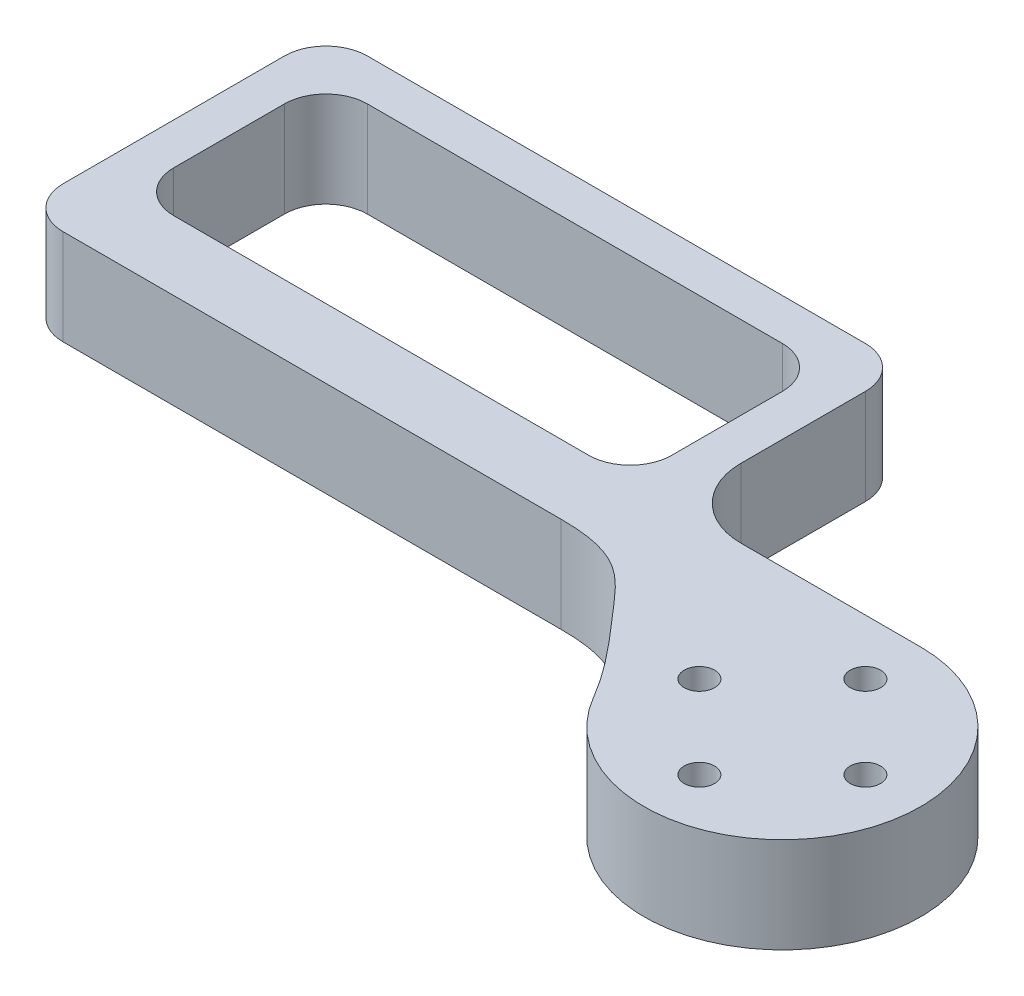
ISO-10303-21;
HEADER;
FILE_DESCRIPTION(('STEP AP214'),'2;1');
FILE_NAME('part.step','',(''),(''),'','','');
FILE_SCHEMA(('AUTOMOTIVE_DESIGN { 1 0 10303 214 1 1 1 1 }'));
ENDSEC;
DATA;
#1=APPLICATION_CONTEXT('core data for automotive mechanical design processes');
#2=APPLICATION_PROTOCOL_DEFINITION('international standard','automotive_design',2000,#1);
#3=PRODUCT_CONTEXT('',#1,'mechanical');
#4=PRODUCT('Part','Part','',(#3));
#5=PRODUCT_RELATED_PRODUCT_CATEGORY('part','',(#4));
#6=PRODUCT_DEFINITION_FORMATION('','',#4);
#7=PRODUCT_DEFINITION_CONTEXT('part definition',#1,'design');
#8=PRODUCT_DEFINITION('design','',#6,#7);
#9=PRODUCT_DEFINITION_SHAPE('','',#8);
#10=(LENGTH_UNIT() NAMED_UNIT(*) SI_UNIT(.MILLI.,.METRE.));
#11=(NAMED_UNIT(*) PLANE_ANGLE_UNIT() SI_UNIT($,.RADIAN.));
#12=(NAMED_UNIT(*) SI_UNIT($,.STERADIAN.) SOLID_ANGLE_UNIT());
#13=UNCERTAINTY_MEASURE_WITH_UNIT(LENGTH_MEASURE(1.E-05),#10,'distance_accuracy_value','');
#14=(GEOMETRIC_REPRESENTATION_CONTEXT(3) GLOBAL_UNCERTAINTY_ASSIGNED_CONTEXT((#13)) GLOBAL_UNIT_ASSIGNED_CONTEXT((#10,
#11,#12)) REPRESENTATION_CONTEXT('',''));
#15=CARTESIAN_POINT('',(0.,0.,0.));
#16=DIRECTION('',(0.,0.,1.));
#17=DIRECTION('',(1.,0.,0.));
#18=AXIS2_PLACEMENT_3D('',#15,#16,#17);
#19=CARTESIAN_POINT('',(0.,0.,0.));
#20=DIRECTION('',(0.,1.,0.));
#21=DIRECTION('',(0.,0.,1.));
#22=AXIS2_PLACEMENT_3D('',#19,#20,#21);
#23=PLANE('',#22);
#24=CARTESIAN_POINT('',(0.,0.,0.));
#25=DIRECTION('',(0.,-1.,0.));
#26=DIRECTION('',(0.,0.,-1.));
#27=AXIS2_PLACEMENT_3D('',#24,#25,#26);
#28=CIRCLE('',#27,8.15);
#29=CARTESIAN_POINT('',(0.,0.,-8.15));
#30=VERTEX_POINT('',#29);
#31=EDGE_CURVE('E258',#30,#30,#28,.T.);
#32=ORIENTED_EDGE('',*,*,#31,.T.);
#33=EDGE_LOOP('',(#32));
#34=FACE_BOUND('',#33,.T.);
#35=CARTESIAN_POINT('',(-6.,0.,0.));
#36=DIRECTION('',(0.,1.,0.));
#37=DIRECTION('',(0.,0.,-1.));
#38=AXIS2_PLACEMENT_3D('',#35,#36,#37);
#39=CIRCLE('',#38,1.1);
#40=CARTESIAN_POINT('',(-6.,0.,-1.1));
#41=VERTEX_POINT('',#40);
#42=EDGE_CURVE('E241',#41,#41,#39,.T.);
#43=ORIENTED_EDGE('',*,*,#42,.T.);
#44=EDGE_LOOP('',(#43));
#45=FACE_BOUND('',#44,.T.);
#46=CARTESIAN_POINT('',(6.,0.,0.));
#47=DIRECTION('',(0.,1.,0.));
#48=DIRECTION('',(0.,0.,1.));
#49=AXIS2_PLACEMENT_3D('',#46,#47,#48);
#50=CIRCLE('',#49,1.1);
#51=CARTESIAN_POINT('',(6.,0.,1.1));
#52=VERTEX_POINT('',#51);
#53=EDGE_CURVE('E401',#52,#52,#50,.T.);
#54=ORIENTED_EDGE('',*,*,#53,.T.);
#55=EDGE_LOOP('',(#54));
#56=FACE_BOUND('',#55,.T.);
#57=CARTESIAN_POINT('',(0.,0.,6.));
#58=DIRECTION('',(0.,1.,0.));
#59=DIRECTION('',(0.,0.,-1.));
#60=AXIS2_PLACEMENT_3D('',#57,#58,#59);
#61=CIRCLE('',#60,1.1);
#62=CARTESIAN_POINT('',(0.,0.,4.9));
#63=VERTEX_POINT('',#62);
#64=EDGE_CURVE('E409',#63,#63,#61,.T.);
#65=ORIENTED_EDGE('',*,*,#64,.T.);
#66=EDGE_LOOP('',(#65));
#67=FACE_BOUND('',#66,.T.);
#68=CARTESIAN_POINT('',(0.,0.,-6.));
#69=DIRECTION('',(0.,1.,0.));
#70=DIRECTION('',(0.,0.,1.));
#71=AXIS2_PLACEMENT_3D('',#68,#69,#70);
#72=CIRCLE('',#71,1.1);
#73=CARTESIAN_POINT('',(0.,0.,-4.9));
#74=VERTEX_POINT('',#73);
#75=EDGE_CURVE('E417',#74,#74,#72,.T.);
#76=ORIENTED_EDGE('',*,*,#75,.T.);
#77=EDGE_LOOP('',(#76));
#78=FACE_BOUND('',#77,.T.);
#79=ADVANCED_FACE('F87',(#34,#45,#56,#67,#78),#23,.F.);
#80=CARTESIAN_POINT('',(0.,-72.8010988928052,-10.));
#81=DIRECTION('',(0.,0.,1.));
#82=DIRECTION('',(1.,0.,0.));
#83=AXIS2_PLACEMENT_3D('',#80,#81,#82);
#84=PLANE('',#83);
#85=DIRECTION('',(1.,0.,0.));
#86=VECTOR('',#85,1.);
#87=CARTESIAN_POINT('',(0.,4.,-10.));
#88=LINE('',#87,#86);
#89=CARTESIAN_POINT('',(-54.,4.,-10.));
#90=VERTEX_POINT('',#89);
#91=CARTESIAN_POINT('',(-24.,4.,-10.));
#92=VERTEX_POINT('',#91);
#93=EDGE_CURVE('E387',#90,#92,#88,.T.);
#94=ORIENTED_EDGE('',*,*,#93,.T.);
#95=DIRECTION('',(0.,1.,0.));
#96=VECTOR('',#95,1.);
#97=CARTESIAN_POINT('',(-24.,-2.9,-10.));
#98=LINE('',#97,#96);
#99=CARTESIAN_POINT('',(-24.,-2.9,-10.));
#100=VERTEX_POINT('',#99);
#101=EDGE_CURVE('E468',#92,#100,#98,.F.);
#102=ORIENTED_EDGE('',*,*,#101,.T.);
#103=DIRECTION('',(-1.,0.,0.));
#104=VECTOR('',#103,1.);
#105=CARTESIAN_POINT('',(0.,-2.9,-10.));
#106=LINE('',#105,#104);
#107=CARTESIAN_POINT('',(-54.,-2.9,-10.));
#108=VERTEX_POINT('',#107);
#109=EDGE_CURVE('E568',#100,#108,#106,.T.);
#110=ORIENTED_EDGE('',*,*,#109,.T.);
#111=DIRECTION('',(0.,1.,0.));
#112=VECTOR('',#111,1.);
#113=CARTESIAN_POINT('',(-54.,-72.8010988928052,-10.));
#114=LINE('',#113,#112);
#115=EDGE_CURVE('E464',#108,#90,#114,.T.);
#116=ORIENTED_EDGE('',*,*,#115,.T.);
#117=EDGE_LOOP('',(#94,#102,#110,#116));
#118=FACE_BOUND('',#117,.T.);
#119=ADVANCED_FACE('F317',(#118),#84,.F.);
#120=CARTESIAN_POINT('',(0.,4.,0.));
#121=DIRECTION('',(0.,-1.,0.));
#122=DIRECTION('',(0.,0.,-1.));
#123=AXIS2_PLACEMENT_3D('',#120,#121,#122);
#124=CYLINDRICAL_SURFACE('',#123,10.);
#125=DIRECTION('',(0.,1.,0.));
#126=VECTOR('',#125,1.);
#127=CARTESIAN_POINT('',(0.,-72.8010988928052,-10.));
#128=LINE('',#127,#126);
#129=CARTESIAN_POINT('',(0.,-2.9,-10.));
#130=VERTEX_POINT('',#129);
#131=CARTESIAN_POINT('',(0.,4.,-10.));
#132=VERTEX_POINT('',#131);
#133=EDGE_CURVE('E384',#130,#132,#128,.T.);
#134=ORIENTED_EDGE('',*,*,#133,.T.);
#135=CARTESIAN_POINT('',(0.,4.,0.));
#136=DIRECTION('',(0.,1.,0.));
#137=DIRECTION('',(0.,0.,1.));
#138=AXIS2_PLACEMENT_3D('',#135,#136,#137);
#139=CIRCLE('',#138,10.);
#140=CARTESIAN_POINT('',(-8.66025403784439,4.,5.));
#141=VERTEX_POINT('',#140);
#142=EDGE_CURVE('E239',#141,#132,#139,.T.);
#143=ORIENTED_EDGE('',*,*,#142,.F.);
#144=DIRECTION('',(0.,1.,0.));
#145=VECTOR('',#144,1.);
#146=CARTESIAN_POINT('',(-8.66025403784439,-52.3045840769112,5.));
#147=LINE('',#146,#145);
#148=CARTESIAN_POINT('',(-8.66025403784439,-2.9,4.99999999999999));
#149=VERTEX_POINT('',#148);
#150=EDGE_CURVE('E223',#149,#141,#147,.T.);
#151=ORIENTED_EDGE('',*,*,#150,.F.);
#152=CARTESIAN_POINT('',(0.,-2.9,0.));
#153=DIRECTION('',(0.,-1.,0.));
#154=DIRECTION('',(0.,0.,-1.));
#155=AXIS2_PLACEMENT_3D('',#152,#153,#154);
#156=CIRCLE('',#155,10.);
#157=EDGE_CURVE('E237',#130,#149,#156,.T.);
#158=ORIENTED_EDGE('',*,*,#157,.F.);
#159=EDGE_LOOP('',(#134,#143,#151,#158));
#160=FACE_BOUND('',#159,.T.);
#161=ADVANCED_FACE('F236',(#160),#124,.T.);
#162=CARTESIAN_POINT('',(0.,4.,0.));
#163=DIRECTION('',(0.,1.,0.));
#164=DIRECTION('',(0.,0.,1.));
#165=AXIS2_PLACEMENT_3D('',#162,#163,#164);
#166=PLANE('',#165);
#167=DIRECTION('',(0.,0.,1.));
#168=VECTOR('',#167,1.);
#169=CARTESIAN_POINT('',(-60.,4.,0.));
#170=LINE('',#169,#168);
#171=CARTESIAN_POINT('',(-60.,4.,-24.));
#172=VERTEX_POINT('',#171);
#173=CARTESIAN_POINT('',(-60.,4.,-8.));
#174=VERTEX_POINT('',#173);
#175=EDGE_CURVE('E242',#172,#174,#170,.T.);
#176=ORIENTED_EDGE('',*,*,#175,.T.);
#177=CARTESIAN_POINT('',(-57.,4.,-8.));
#178=DIRECTION('',(0.,1.,0.));
#179=DIRECTION('',(0.,0.,1.));
#180=AXIS2_PLACEMENT_3D('',#177,#178,#179);
#181=CIRCLE('',#180,3.);
#182=CARTESIAN_POINT('',(-57.,4.,-5.));
#183=VERTEX_POINT('',#182);
#184=EDGE_CURVE('E524',#174,#183,#181,.T.);
#185=ORIENTED_EDGE('',*,*,#184,.T.);
#186=DIRECTION('',(-1.,0.,0.));
#187=VECTOR('',#186,1.);
#188=CARTESIAN_POINT('',(-21.,4.,-5.));
#189=LINE('',#188,#187);
#190=CARTESIAN_POINT('',(-21.,4.,-5.));
#191=VERTEX_POINT('',#190);
#192=EDGE_CURVE('E518',#191,#183,#189,.T.);
#193=ORIENTED_EDGE('',*,*,#192,.F.);
#194=CARTESIAN_POINT('',(-8.66025403784439,4.,5.));
#195=CARTESIAN_POINT('',(-10.0020196497192,4.,2.67599378838415));
#196=CARTESIAN_POINT('',(-14.6498259757073,4.,-2.46914105100477));
#197=CARTESIAN_POINT('',(-16.5369802423293,4.,-5.));
#198=CARTESIAN_POINT('',(-21.,4.,-5.));
#199=B_SPLINE_CURVE_WITH_KNOTS('',3,(#194,#195,#196,#197,#198),.UNSPECIFIED.,.F.,.F.,(4,1,4),
(0.,0.396923373453757,1.),.UNSPECIFIED.);
#200=EDGE_CURVE('E229',#141,#191,#199,.T.);
#201=ORIENTED_EDGE('',*,*,#200,.F.);
#202=ORIENTED_EDGE('',*,*,#142,.T.);
#203=CARTESIAN_POINT('',(-13.,4.,-10.));
#204=VERTEX_POINT('',#203);
#205=EDGE_CURVE('E385',#204,#132,#88,.T.);
#206=ORIENTED_EDGE('',*,*,#205,.F.);
#207=CARTESIAN_POINT('',(-13.,4.,-15.));
#208=DIRECTION('',(0.,1.,0.));
#209=DIRECTION('',(0.,0.,1.));
#210=AXIS2_PLACEMENT_3D('',#207,#208,#209);
#211=CIRCLE('',#210,5.);
#212=CARTESIAN_POINT('',(-18.,4.,-15.));
#213=VERTEX_POINT('',#212);
#214=EDGE_CURVE('E377',#204,#213,#211,.F.);
#215=ORIENTED_EDGE('',*,*,#214,.T.);
#216=DIRECTION('',(0.,0.,-1.));
#217=VECTOR('',#216,1.);
#218=CARTESIAN_POINT('',(-18.,4.,0.));
#219=LINE('',#218,#217);
#220=CARTESIAN_POINT('',(-18.,4.,-24.));
#221=VERTEX_POINT('',#220);
#222=EDGE_CURVE('E558',#213,#221,#219,.T.);
#223=ORIENTED_EDGE('',*,*,#222,.T.);
#224=CARTESIAN_POINT('',(-21.,4.,-24.));
#225=DIRECTION('',(0.,1.,0.));
#226=DIRECTION('',(0.,0.,1.));
#227=AXIS2_PLACEMENT_3D('',#224,#225,#226);
#228=CIRCLE('',#227,3.);
#229=CARTESIAN_POINT('',(-21.,4.,-27.));
#230=VERTEX_POINT('',#229);
#231=EDGE_CURVE('E437',#221,#230,#228,.T.);
#232=ORIENTED_EDGE('',*,*,#231,.T.);
#233=DIRECTION('',(1.,0.,0.));
#234=VECTOR('',#233,1.);
#235=CARTESIAN_POINT('',(0.,4.,-27.));
#236=LINE('',#235,#234);
#237=CARTESIAN_POINT('',(-57.,4.,-27.));
#238=VERTEX_POINT('',#237);
#239=EDGE_CURVE('E560',#238,#230,#236,.T.);
#240=ORIENTED_EDGE('',*,*,#239,.F.);
#241=CARTESIAN_POINT('',(-57.,4.,-24.));
#242=DIRECTION('',(0.,1.,0.));
#243=DIRECTION('',(0.,0.,1.));
#244=AXIS2_PLACEMENT_3D('',#241,#242,#243);
#245=CIRCLE('',#244,3.);
#246=EDGE_CURVE('E440',#238,#172,#245,.T.);
#247=ORIENTED_EDGE('',*,*,#246,.T.);
#248=EDGE_LOOP('',(#176,#185,#193,#201,#202,#206,#215,#223,#232,#240,#247));
#249=FACE_BOUND('',#248,.T.);
#250=CARTESIAN_POINT('',(6.,4.,0.));
#251=DIRECTION('',(0.,1.,0.));
#252=DIRECTION('',(0.,0.,1.));
#253=AXIS2_PLACEMENT_3D('',#250,#251,#252);
#254=CIRCLE('',#253,1.1);
#255=CARTESIAN_POINT('',(6.,4.,1.1));
#256=VERTEX_POINT('',#255);
#257=EDGE_CURVE('E405',#256,#256,#254,.T.);
#258=ORIENTED_EDGE('',*,*,#257,.F.);
#259=EDGE_LOOP('',(#258));
#260=FACE_BOUND('',#259,.T.);
#261=CARTESIAN_POINT('',(0.,4.,-6.));
#262=DIRECTION('',(0.,1.,0.));
#263=DIRECTION('',(0.,0.,1.));
#264=AXIS2_PLACEMENT_3D('',#261,#262,#263);
#265=CIRCLE('',#264,1.1);
#266=CARTESIAN_POINT('',(0.,4.,-4.9));
#267=VERTEX_POINT('',#266);
#268=EDGE_CURVE('E421',#267,#267,#265,.T.);
#269=ORIENTED_EDGE('',*,*,#268,.F.);
#270=EDGE_LOOP('',(#269));
#271=FACE_BOUND('',#270,.T.);
#272=CARTESIAN_POINT('',(0.,4.,6.));
#273=DIRECTION('',(0.,1.,0.));
#274=DIRECTION('',(0.,0.,-1.));
#275=AXIS2_PLACEMENT_3D('',#272,#273,#274);
#276=CIRCLE('',#275,1.1);
#277=CARTESIAN_POINT('',(0.,4.,4.9));
#278=VERTEX_POINT('',#277);
#279=EDGE_CURVE('E413',#278,#278,#276,.T.);
#280=ORIENTED_EDGE('',*,*,#279,.F.);
#281=EDGE_LOOP('',(#280));
#282=FACE_BOUND('',#281,.T.);
#283=CARTESIAN_POINT('',(-6.,4.,0.));
#284=DIRECTION('',(0.,1.,0.));
#285=DIRECTION('',(0.,0.,-1.));
#286=AXIS2_PLACEMENT_3D('',#283,#284,#285);
#287=CIRCLE('',#286,1.1);
#288=CARTESIAN_POINT('',(-6.,4.,-1.1));
#289=VERTEX_POINT('',#288);
#290=EDGE_CURVE('E397',#289,#289,#287,.T.);
#291=ORIENTED_EDGE('',*,*,#290,.F.);
#292=EDGE_LOOP('',(#291));
#293=FACE_BOUND('',#292,.T.);
#294=DIRECTION('',(0.,0.,-1.));
#295=VECTOR('',#294,1.);
#296=CARTESIAN_POINT('',(-21.,4.,0.));
#297=LINE('',#296,#295);
#298=CARTESIAN_POINT('',(-21.,4.,-13.));
#299=VERTEX_POINT('',#298);
#300=CARTESIAN_POINT('',(-21.,4.,-21.));
#301=VERTEX_POINT('',#300);
#302=EDGE_CURVE('E517',#299,#301,#297,.T.);
#303=ORIENTED_EDGE('',*,*,#302,.F.);
#304=CARTESIAN_POINT('',(-24.,4.,-13.));
#305=DIRECTION('',(0.,1.,0.));
#306=DIRECTION('',(0.,0.,1.));
#307=AXIS2_PLACEMENT_3D('',#304,#305,#306);
#308=CIRCLE('',#307,3.);
#309=EDGE_CURVE('E485',#299,#92,#308,.F.);
#310=ORIENTED_EDGE('',*,*,#309,.T.);
#311=ORIENTED_EDGE('',*,*,#93,.F.);
#312=CARTESIAN_POINT('',(-54.,4.,-13.));
#313=DIRECTION('',(0.,1.,0.));
#314=DIRECTION('',(0.,0.,1.));
#315=AXIS2_PLACEMENT_3D('',#312,#313,#314);
#316=CIRCLE('',#315,3.);
#317=CARTESIAN_POINT('',(-57.,4.,-13.));
#318=VERTEX_POINT('',#317);
#319=EDGE_CURVE('E491',#90,#318,#316,.F.);
#320=ORIENTED_EDGE('',*,*,#319,.T.);
#321=DIRECTION('',(0.,0.,-1.));
#322=VECTOR('',#321,1.);
#323=CARTESIAN_POINT('',(-57.,4.,0.));
#324=LINE('',#323,#322);
#325=CARTESIAN_POINT('',(-57.,4.,-21.));
#326=VERTEX_POINT('',#325);
#327=EDGE_CURVE('E550',#318,#326,#324,.T.);
#328=ORIENTED_EDGE('',*,*,#327,.T.);
#329=CARTESIAN_POINT('',(-54.,4.,-21.));
#330=DIRECTION('',(0.,1.,0.));
#331=DIRECTION('',(0.,0.,1.));
#332=AXIS2_PLACEMENT_3D('',#329,#330,#331);
#333=CIRCLE('',#332,3.);
#334=CARTESIAN_POINT('',(-54.,4.,-24.));
#335=VERTEX_POINT('',#334);
#336=EDGE_CURVE('E497',#326,#335,#333,.F.);
#337=ORIENTED_EDGE('',*,*,#336,.T.);
#338=DIRECTION('',(1.,0.,0.));
#339=VECTOR('',#338,1.);
#340=CARTESIAN_POINT('',(0.,4.,-24.));
#341=LINE('',#340,#339);
#342=CARTESIAN_POINT('',(-24.,4.,-24.));
#343=VERTEX_POINT('',#342);
#344=EDGE_CURVE('E554',#335,#343,#341,.T.);
#345=ORIENTED_EDGE('',*,*,#344,.T.);
#346=CARTESIAN_POINT('',(-24.,4.,-21.));
#347=DIRECTION('',(0.,1.,0.));
#348=DIRECTION('',(0.,0.,1.));
#349=AXIS2_PLACEMENT_3D('',#346,#347,#348);
#350=CIRCLE('',#349,3.);
#351=EDGE_CURVE('E503',#343,#301,#350,.F.);
#352=ORIENTED_EDGE('',*,*,#351,.T.);
#353=EDGE_LOOP('',(#303,#310,#311,#320,#328,#337,#345,#352));
#354=FACE_BOUND('',#353,.T.);
#355=ADVANCED_FACE('F336',(#249,#260,#271,#282,#293,#354),#166,.T.);
#356=CARTESIAN_POINT('',(0.,4.,-6.));
#357=DIRECTION('',(0.,-1.,0.));
#358=DIRECTION('',(0.,0.,-1.));
#359=AXIS2_PLACEMENT_3D('',#356,#357,#358);
#360=CYLINDRICAL_SURFACE('',#359,1.1);
#361=ORIENTED_EDGE('',*,*,#268,.T.);
#362=EDGE_LOOP('',(#361));
#363=FACE_BOUND('',#362,.T.);
#364=ORIENTED_EDGE('',*,*,#75,.F.);
#365=EDGE_LOOP('',(#364));
#366=FACE_BOUND('',#365,.T.);
#367=ADVANCED_FACE('F332',(#363,#366),#360,.F.);
#368=CARTESIAN_POINT('',(0.,4.,6.));
#369=DIRECTION('',(0.,-1.,0.));
#370=DIRECTION('',(0.,0.,-1.));
#371=AXIS2_PLACEMENT_3D('',#368,#369,#370);
#372=CYLINDRICAL_SURFACE('',#371,1.1);
#373=ORIENTED_EDGE('',*,*,#279,.T.);
#374=EDGE_LOOP('',(#373));
#375=FACE_BOUND('',#374,.T.);
#376=ORIENTED_EDGE('',*,*,#64,.F.);
#377=EDGE_LOOP('',(#376));
#378=FACE_BOUND('',#377,.T.);
#379=ADVANCED_FACE('F328',(#375,#378),#372,.F.);
#380=CARTESIAN_POINT('',(6.,4.,0.));
#381=DIRECTION('',(0.,-1.,0.));
#382=DIRECTION('',(0.,0.,-1.));
#383=AXIS2_PLACEMENT_3D('',#380,#381,#382);
#384=CYLINDRICAL_SURFACE('',#383,1.1);
#385=ORIENTED_EDGE('',*,*,#257,.T.);
#386=EDGE_LOOP('',(#385));
#387=FACE_BOUND('',#386,.T.);
#388=ORIENTED_EDGE('',*,*,#53,.F.);
#389=EDGE_LOOP('',(#388));
#390=FACE_BOUND('',#389,.T.);
#391=ADVANCED_FACE('F324',(#387,#390),#384,.F.);
#392=CARTESIAN_POINT('',(-6.,4.,0.));
#393=DIRECTION('',(0.,-1.,0.));
#394=DIRECTION('',(0.,0.,-1.));
#395=AXIS2_PLACEMENT_3D('',#392,#393,#394);
#396=CYLINDRICAL_SURFACE('',#395,1.1);
#397=ORIENTED_EDGE('',*,*,#290,.T.);
#398=EDGE_LOOP('',(#397));
#399=FACE_BOUND('',#398,.T.);
#400=ORIENTED_EDGE('',*,*,#42,.F.);
#401=EDGE_LOOP('',(#400));
#402=FACE_BOUND('',#401,.T.);
#403=ADVANCED_FACE('F320',(#399,#402),#396,.F.);
#404=CARTESIAN_POINT('',(-60.,-52.3045840769112,0.));
#405=DIRECTION('',(-1.,0.,0.));
#406=DIRECTION('',(0.,0.,1.));
#407=AXIS2_PLACEMENT_3D('',#404,#405,#406);
#408=PLANE('',#407);
#409=DIRECTION('',(0.,0.,-1.));
#410=VECTOR('',#409,1.);
#411=CARTESIAN_POINT('',(-60.,-2.9,0.));
#412=LINE('',#411,#410);
#413=CARTESIAN_POINT('',(-60.,-2.9,-8.));
#414=VERTEX_POINT('',#413);
#415=CARTESIAN_POINT('',(-60.,-2.9,-24.));
#416=VERTEX_POINT('',#415);
#417=EDGE_CURVE('E535',#414,#416,#412,.T.);
#418=ORIENTED_EDGE('',*,*,#417,.F.);
#419=DIRECTION('',(0.,1.,0.));
#420=VECTOR('',#419,1.);
#421=CARTESIAN_POINT('',(-60.,4.,-8.));
#422=LINE('',#421,#420);
#423=EDGE_CURVE('E511',#414,#174,#422,.T.);
#424=ORIENTED_EDGE('',*,*,#423,.T.);
#425=ORIENTED_EDGE('',*,*,#175,.F.);
#426=DIRECTION('',(0.,1.,0.));
#427=VECTOR('',#426,1.);
#428=CARTESIAN_POINT('',(-60.,-2.9,-24.));
#429=LINE('',#428,#427);
#430=EDGE_CURVE('E443',#172,#416,#429,.F.);
#431=ORIENTED_EDGE('',*,*,#430,.T.);
#432=EDGE_LOOP('',(#418,#424,#425,#431));
#433=FACE_BOUND('',#432,.T.);
#434=ADVANCED_FACE('F315',(#433),#408,.T.);
#435=ORIENTED_EDGE('',*,*,#133,.F.);
#436=DIRECTION('',(1.,0.,0.));
#437=VECTOR('',#436,1.);
#438=CARTESIAN_POINT('',(0.,-2.9,-10.));
#439=LINE('',#438,#437);
#440=CARTESIAN_POINT('',(-13.,-2.9,-10.));
#441=VERTEX_POINT('',#440);
#442=EDGE_CURVE('E249',#441,#130,#439,.T.);
#443=ORIENTED_EDGE('',*,*,#442,.F.);
#444=DIRECTION('',(0.,1.,0.));
#445=VECTOR('',#444,1.);
#446=CARTESIAN_POINT('',(-13.,-72.8010988928052,-10.));
#447=LINE('',#446,#445);
#448=EDGE_CURVE('E376',#441,#204,#447,.T.);
#449=ORIENTED_EDGE('',*,*,#448,.T.);
#450=ORIENTED_EDGE('',*,*,#205,.T.);
#451=EDGE_LOOP('',(#435,#443,#449,#450));
#452=FACE_BOUND('',#451,.T.);
#453=ADVANCED_FACE('F302',(#452),#84,.F.);
#454=CARTESIAN_POINT('',(-18.,-2.9,0.));
#455=DIRECTION('',(1.,0.,0.));
#456=DIRECTION('',(0.,0.,-1.));
#457=AXIS2_PLACEMENT_3D('',#454,#455,#456);
#458=PLANE('',#457);
#459=DIRECTION('',(0.,1.,0.));
#460=VECTOR('',#459,1.);
#461=CARTESIAN_POINT('',(-18.,-2.9,-15.));
#462=LINE('',#461,#460);
#463=CARTESIAN_POINT('',(-18.,-2.9,-15.));
#464=VERTEX_POINT('',#463);
#465=EDGE_CURVE('E103',#213,#464,#462,.F.);
#466=ORIENTED_EDGE('',*,*,#465,.T.);
#467=DIRECTION('',(0.,0.,-1.));
#468=VECTOR('',#467,1.);
#469=CARTESIAN_POINT('',(-18.,-2.9,0.));
#470=LINE('',#469,#468);
#471=CARTESIAN_POINT('',(-18.,-2.9,-24.));
#472=VERTEX_POINT('',#471);
#473=EDGE_CURVE('E383',#464,#472,#470,.T.);
#474=ORIENTED_EDGE('',*,*,#473,.T.);
#475=DIRECTION('',(0.,1.,0.));
#476=VECTOR('',#475,1.);
#477=CARTESIAN_POINT('',(-18.,4.,-24.));
#478=LINE('',#477,#476);
#479=EDGE_CURVE('E453',#472,#221,#478,.T.);
#480=ORIENTED_EDGE('',*,*,#479,.T.);
#481=ORIENTED_EDGE('',*,*,#222,.F.);
#482=EDGE_LOOP('',(#466,#474,#480,#481));
#483=FACE_BOUND('',#482,.T.);
#484=ADVANCED_FACE('F298',(#483),#458,.T.);
#485=CARTESIAN_POINT('',(0.,-2.9,-27.));
#486=DIRECTION('',(0.,0.,1.));
#487=DIRECTION('',(1.,0.,0.));
#488=AXIS2_PLACEMENT_3D('',#485,#486,#487);
#489=PLANE('',#488);
#490=DIRECTION('',(1.,0.,0.));
#491=VECTOR('',#490,1.);
#492=CARTESIAN_POINT('',(0.,-2.9,-27.));
#493=LINE('',#492,#491);
#494=CARTESIAN_POINT('',(-57.,-2.9,-27.));
#495=VERTEX_POINT('',#494);
#496=CARTESIAN_POINT('',(-21.,-2.9,-27.));
#497=VERTEX_POINT('',#496);
#498=EDGE_CURVE('E539',#495,#497,#493,.T.);
#499=ORIENTED_EDGE('',*,*,#498,.F.);
#500=DIRECTION('',(0.,1.,0.));
#501=VECTOR('',#500,1.);
#502=CARTESIAN_POINT('',(-57.,4.,-27.));
#503=LINE('',#502,#501);
#504=EDGE_CURVE('E433',#495,#238,#503,.T.);
#505=ORIENTED_EDGE('',*,*,#504,.T.);
#506=ORIENTED_EDGE('',*,*,#239,.T.);
#507=DIRECTION('',(0.,1.,0.));
#508=VECTOR('',#507,1.);
#509=CARTESIAN_POINT('',(-21.,-2.9,-27.));
#510=LINE('',#509,#508);
#511=EDGE_CURVE('E430',#230,#497,#510,.F.);
#512=ORIENTED_EDGE('',*,*,#511,.T.);
#513=EDGE_LOOP('',(#499,#505,#506,#512));
#514=FACE_BOUND('',#513,.T.);
#515=ADVANCED_FACE('F294',(#514),#489,.F.);
#516=CARTESIAN_POINT('',(-21.,-2.9,0.));
#517=DIRECTION('',(1.,0.,0.));
#518=DIRECTION('',(0.,0.,-1.));
#519=AXIS2_PLACEMENT_3D('',#516,#517,#518);
#520=PLANE('',#519);
#521=DIRECTION('',(0.,0.,-1.));
#522=VECTOR('',#521,1.);
#523=CARTESIAN_POINT('',(-21.,-2.9,0.));
#524=LINE('',#523,#522);
#525=CARTESIAN_POINT('',(-21.,-2.9,-13.));
#526=VERTEX_POINT('',#525);
#527=CARTESIAN_POINT('',(-21.,-2.9,-21.));
#528=VERTEX_POINT('',#527);
#529=EDGE_CURVE('E563',#526,#528,#524,.T.);
#530=ORIENTED_EDGE('',*,*,#529,.F.);
#531=DIRECTION('',(0.,1.,0.));
#532=VECTOR('',#531,1.);
#533=CARTESIAN_POINT('',(-21.,4.,-13.));
#534=LINE('',#533,#532);
#535=EDGE_CURVE('E460',#526,#299,#534,.T.);
#536=ORIENTED_EDGE('',*,*,#535,.T.);
#537=ORIENTED_EDGE('',*,*,#302,.T.);
#538=DIRECTION('',(0.,1.,0.));
#539=VECTOR('',#538,1.);
#540=CARTESIAN_POINT('',(-21.,-2.9,-21.));
#541=LINE('',#540,#539);
#542=EDGE_CURVE('E457',#301,#528,#541,.F.);
#543=ORIENTED_EDGE('',*,*,#542,.T.);
#544=EDGE_LOOP('',(#530,#536,#537,#543));
#545=FACE_BOUND('',#544,.T.);
#546=ADVANCED_FACE('F297',(#545),#520,.F.);
#547=CARTESIAN_POINT('',(0.,-2.9,-24.));
#548=DIRECTION('',(0.,0.,1.));
#549=DIRECTION('',(1.,0.,0.));
#550=AXIS2_PLACEMENT_3D('',#547,#548,#549);
#551=PLANE('',#550);
#552=ORIENTED_EDGE('',*,*,#344,.F.);
#553=DIRECTION('',(0.,1.,0.));
#554=VECTOR('',#553,1.);
#555=CARTESIAN_POINT('',(-54.,-2.9,-24.));
#556=LINE('',#555,#554);
#557=CARTESIAN_POINT('',(-54.,-2.9,-24.));
#558=VERTEX_POINT('',#557);
#559=EDGE_CURVE('E482',#335,#558,#556,.F.);
#560=ORIENTED_EDGE('',*,*,#559,.T.);
#561=DIRECTION('',(1.,0.,0.));
#562=VECTOR('',#561,1.);
#563=CARTESIAN_POINT('',(0.,-2.9,-24.));
#564=LINE('',#563,#562);
#565=CARTESIAN_POINT('',(-24.,-2.9,-24.));
#566=VERTEX_POINT('',#565);
#567=EDGE_CURVE('E580',#558,#566,#564,.T.);
#568=ORIENTED_EDGE('',*,*,#567,.T.);
#569=DIRECTION('',(0.,1.,0.));
#570=VECTOR('',#569,1.);
#571=CARTESIAN_POINT('',(-24.,-2.9,-24.));
#572=LINE('',#571,#570);
#573=EDGE_CURVE('E478',#566,#343,#572,.T.);
#574=ORIENTED_EDGE('',*,*,#573,.T.);
#575=EDGE_LOOP('',(#552,#560,#568,#574));
#576=FACE_BOUND('',#575,.T.);
#577=ADVANCED_FACE('F303',(#576),#551,.T.);
#578=CARTESIAN_POINT('',(-57.,-2.9,0.));
#579=DIRECTION('',(1.,0.,0.));
#580=DIRECTION('',(0.,0.,-1.));
#581=AXIS2_PLACEMENT_3D('',#578,#579,#580);
#582=PLANE('',#581);
#583=ORIENTED_EDGE('',*,*,#327,.F.);
#584=DIRECTION('',(0.,1.,0.));
#585=VECTOR('',#584,1.);
#586=CARTESIAN_POINT('',(-57.,-2.9,-13.));
#587=LINE('',#586,#585);
#588=CARTESIAN_POINT('',(-57.,-2.9,-13.));
#589=VERTEX_POINT('',#588);
#590=EDGE_CURVE('E475',#318,#589,#587,.F.);
#591=ORIENTED_EDGE('',*,*,#590,.T.);
#592=DIRECTION('',(0.,0.,-1.));
#593=VECTOR('',#592,1.);
#594=CARTESIAN_POINT('',(-57.,-2.9,0.));
#595=LINE('',#594,#593);
#596=CARTESIAN_POINT('',(-57.,-2.9,-21.));
#597=VERTEX_POINT('',#596);
#598=EDGE_CURVE('E574',#589,#597,#595,.T.);
#599=ORIENTED_EDGE('',*,*,#598,.T.);
#600=DIRECTION('',(0.,1.,0.));
#601=VECTOR('',#600,1.);
#602=CARTESIAN_POINT('',(-57.,4.,-21.));
#603=LINE('',#602,#601);
#604=EDGE_CURVE('E471',#597,#326,#603,.T.);
#605=ORIENTED_EDGE('',*,*,#604,.T.);
#606=EDGE_LOOP('',(#583,#591,#599,#605));
#607=FACE_BOUND('',#606,.T.);
#608=ADVANCED_FACE('F292',(#607),#582,.T.);
#609=CARTESIAN_POINT('',(0.,-2.9,0.));
#610=DIRECTION('',(0.,1.,0.));
#611=DIRECTION('',(0.,0.,1.));
#612=AXIS2_PLACEMENT_3D('',#609,#610,#611);
#613=PLANE('',#612);
#614=ORIENTED_EDGE('',*,*,#109,.F.);
#615=CARTESIAN_POINT('',(-24.,-2.9,-13.));
#616=DIRECTION('',(0.,1.,0.));
#617=DIRECTION('',(0.,0.,1.));
#618=AXIS2_PLACEMENT_3D('',#615,#616,#617);
#619=CIRCLE('',#618,3.);
#620=EDGE_CURVE('E488',#100,#526,#619,.T.);
#621=ORIENTED_EDGE('',*,*,#620,.T.);
#622=ORIENTED_EDGE('',*,*,#529,.T.);
#623=CARTESIAN_POINT('',(-24.,-2.9,-21.));
#624=DIRECTION('',(0.,1.,0.));
#625=DIRECTION('',(0.,0.,1.));
#626=AXIS2_PLACEMENT_3D('',#623,#624,#625);
#627=CIRCLE('',#626,3.);
#628=EDGE_CURVE('E380',#528,#566,#627,.T.);
#629=ORIENTED_EDGE('',*,*,#628,.T.);
#630=ORIENTED_EDGE('',*,*,#567,.F.);
#631=CARTESIAN_POINT('',(-54.,-2.9,-21.));
#632=DIRECTION('',(0.,1.,0.));
#633=DIRECTION('',(0.,0.,1.));
#634=AXIS2_PLACEMENT_3D('',#631,#632,#633);
#635=CIRCLE('',#634,3.);
#636=EDGE_CURVE('E500',#558,#597,#635,.T.);
#637=ORIENTED_EDGE('',*,*,#636,.T.);
#638=ORIENTED_EDGE('',*,*,#598,.F.);
#639=CARTESIAN_POINT('',(-54.,-2.9,-13.));
#640=DIRECTION('',(0.,1.,0.));
#641=DIRECTION('',(0.,0.,1.));
#642=AXIS2_PLACEMENT_3D('',#639,#640,#641);
#643=CIRCLE('',#642,3.);
#644=EDGE_CURVE('E494',#589,#108,#643,.T.);
#645=ORIENTED_EDGE('',*,*,#644,.T.);
#646=EDGE_LOOP('',(#614,#621,#622,#629,#630,#637,#638,#645));
#647=FACE_BOUND('',#646,.T.);
#648=DIRECTION('',(1.,0.,0.));
#649=VECTOR('',#648,1.);
#650=CARTESIAN_POINT('',(0.,-2.9,-5.));
#651=LINE('',#650,#649);
#652=CARTESIAN_POINT('',(-57.,-2.9,-5.));
#653=VERTEX_POINT('',#652);
#654=CARTESIAN_POINT('',(-21.,-2.9,-5.));
#655=VERTEX_POINT('',#654);
#656=EDGE_CURVE('E230',#653,#655,#651,.T.);
#657=ORIENTED_EDGE('',*,*,#656,.F.);
#658=CARTESIAN_POINT('',(-57.,-2.9,-8.));
#659=DIRECTION('',(0.,1.,0.));
#660=DIRECTION('',(0.,0.,1.));
#661=AXIS2_PLACEMENT_3D('',#658,#659,#660);
#662=CIRCLE('',#661,3.);
#663=EDGE_CURVE('E12',#653,#414,#662,.F.);
#664=ORIENTED_EDGE('',*,*,#663,.T.);
#665=ORIENTED_EDGE('',*,*,#417,.T.);
#666=CARTESIAN_POINT('',(-57.,-2.9,-24.));
#667=DIRECTION('',(0.,1.,0.));
#668=DIRECTION('',(0.,0.,1.));
#669=AXIS2_PLACEMENT_3D('',#666,#667,#668);
#670=CIRCLE('',#669,3.);
#671=EDGE_CURVE('E450',#416,#495,#670,.F.);
#672=ORIENTED_EDGE('',*,*,#671,.T.);
#673=ORIENTED_EDGE('',*,*,#498,.T.);
#674=CARTESIAN_POINT('',(-21.,-2.9,-24.));
#675=DIRECTION('',(0.,1.,0.));
#676=DIRECTION('',(0.,0.,1.));
#677=AXIS2_PLACEMENT_3D('',#674,#675,#676);
#678=CIRCLE('',#677,3.);
#679=EDGE_CURVE('E447',#497,#472,#678,.F.);
#680=ORIENTED_EDGE('',*,*,#679,.T.);
#681=ORIENTED_EDGE('',*,*,#473,.F.);
#682=CARTESIAN_POINT('',(-13.,-2.9,-15.));
#683=DIRECTION('',(0.,-1.,0.));
#684=DIRECTION('',(0.,0.,-1.));
#685=AXIS2_PLACEMENT_3D('',#682,#683,#684);
#686=CIRCLE('',#685,5.);
#687=EDGE_CURVE('E251',#464,#441,#686,.F.);
#688=ORIENTED_EDGE('',*,*,#687,.T.);
#689=ORIENTED_EDGE('',*,*,#442,.T.);
#690=ORIENTED_EDGE('',*,*,#157,.T.);
#691=CARTESIAN_POINT('',(-8.66025403784439,-2.9,5.));
#692=CARTESIAN_POINT('',(-10.0020196497192,-2.9,2.67599378838415));
#693=CARTESIAN_POINT('',(-14.6498259757073,-2.9,-2.46914105100477));
#694=CARTESIAN_POINT('',(-16.5369802423293,-2.9,-5.));
#695=CARTESIAN_POINT('',(-21.,-2.9,-5.));
#696=B_SPLINE_CURVE_WITH_KNOTS('',3,(#691,#692,#693,#694,#695),.UNSPECIFIED.,.F.,.F.,(4,1,4),
(0.,0.396923373453757,1.),.UNSPECIFIED.);
#697=EDGE_CURVE('E219',#655,#149,#696,.F.);
#698=ORIENTED_EDGE('',*,*,#697,.F.);
#699=EDGE_LOOP('',(#657,#664,#665,#672,#673,#680,#681,#688,#689,#690,#698));
#700=FACE_BOUND('',#699,.T.);
#701=CARTESIAN_POINT('',(0.,-2.9,0.));
#702=DIRECTION('',(0.,-1.,0.));
#703=DIRECTION('',(0.,0.,-1.));
#704=AXIS2_PLACEMENT_3D('',#701,#702,#703);
#705=CIRCLE('',#704,8.15);
#706=CARTESIAN_POINT('',(0.,-2.9,-8.15));
#707=VERTEX_POINT('',#706);
#708=EDGE_CURVE('E252',#707,#707,#705,.T.);
#709=ORIENTED_EDGE('',*,*,#708,.F.);
#710=EDGE_LOOP('',(#709));
#711=FACE_BOUND('',#710,.T.);
#712=ADVANCED_FACE('F245',(#647,#700,#711),#613,.F.);
#713=CARTESIAN_POINT('',(-57.,-2.9,-24.));
#714=DIRECTION('',(0.,-1.,0.));
#715=DIRECTION('',(0.,0.,-1.));
#716=AXIS2_PLACEMENT_3D('',#713,#714,#715);
#717=CYLINDRICAL_SURFACE('',#716,3.);
#718=ORIENTED_EDGE('',*,*,#671,.F.);
#719=ORIENTED_EDGE('',*,*,#430,.F.);
#720=ORIENTED_EDGE('',*,*,#246,.F.);
#721=ORIENTED_EDGE('',*,*,#504,.F.);
#722=EDGE_LOOP('',(#718,#719,#720,#721));
#723=FACE_BOUND('',#722,.T.);
#724=ADVANCED_FACE('F291',(#723),#717,.T.);
#725=CARTESIAN_POINT('',(-21.,-2.9,-24.));
#726=DIRECTION('',(0.,-1.,0.));
#727=DIRECTION('',(0.,0.,-1.));
#728=AXIS2_PLACEMENT_3D('',#725,#726,#727);
#729=CYLINDRICAL_SURFACE('',#728,3.);
#730=ORIENTED_EDGE('',*,*,#679,.F.);
#731=ORIENTED_EDGE('',*,*,#511,.F.);
#732=ORIENTED_EDGE('',*,*,#231,.F.);
#733=ORIENTED_EDGE('',*,*,#479,.F.);
#734=EDGE_LOOP('',(#730,#731,#732,#733));
#735=FACE_BOUND('',#734,.T.);
#736=ADVANCED_FACE('F348',(#735),#729,.T.);
#737=CARTESIAN_POINT('',(-24.,-2.9,-13.));
#738=DIRECTION('',(0.,-1.,0.));
#739=DIRECTION('',(0.,0.,-1.));
#740=AXIS2_PLACEMENT_3D('',#737,#738,#739);
#741=CYLINDRICAL_SURFACE('',#740,3.);
#742=ORIENTED_EDGE('',*,*,#620,.F.);
#743=ORIENTED_EDGE('',*,*,#101,.F.);
#744=ORIENTED_EDGE('',*,*,#309,.F.);
#745=ORIENTED_EDGE('',*,*,#535,.F.);
#746=EDGE_LOOP('',(#742,#743,#744,#745));
#747=FACE_BOUND('',#746,.T.);
#748=ADVANCED_FACE('F352',(#747),#741,.F.);
#749=CARTESIAN_POINT('',(-54.,-72.8010988928052,-13.));
#750=DIRECTION('',(0.,1.,0.));
#751=DIRECTION('',(0.,0.,1.));
#752=AXIS2_PLACEMENT_3D('',#749,#750,#751);
#753=CYLINDRICAL_SURFACE('',#752,3.);
#754=ORIENTED_EDGE('',*,*,#644,.F.);
#755=ORIENTED_EDGE('',*,*,#590,.F.);
#756=ORIENTED_EDGE('',*,*,#319,.F.);
#757=ORIENTED_EDGE('',*,*,#115,.F.);
#758=EDGE_LOOP('',(#754,#755,#756,#757));
#759=FACE_BOUND('',#758,.T.);
#760=ADVANCED_FACE('F356',(#759),#753,.F.);
#761=CARTESIAN_POINT('',(-54.,-2.9,-21.));
#762=DIRECTION('',(0.,-1.,0.));
#763=DIRECTION('',(0.,0.,-1.));
#764=AXIS2_PLACEMENT_3D('',#761,#762,#763);
#765=CYLINDRICAL_SURFACE('',#764,3.);
#766=ORIENTED_EDGE('',*,*,#636,.F.);
#767=ORIENTED_EDGE('',*,*,#559,.F.);
#768=ORIENTED_EDGE('',*,*,#336,.F.);
#769=ORIENTED_EDGE('',*,*,#604,.F.);
#770=EDGE_LOOP('',(#766,#767,#768,#769));
#771=FACE_BOUND('',#770,.T.);
#772=ADVANCED_FACE('F360',(#771),#765,.F.);
#773=CARTESIAN_POINT('',(-24.,-2.9,-21.));
#774=DIRECTION('',(0.,1.,0.));
#775=DIRECTION('',(0.,0.,1.));
#776=AXIS2_PLACEMENT_3D('',#773,#774,#775);
#777=CYLINDRICAL_SURFACE('',#776,3.);
#778=ORIENTED_EDGE('',*,*,#628,.F.);
#779=ORIENTED_EDGE('',*,*,#542,.F.);
#780=ORIENTED_EDGE('',*,*,#351,.F.);
#781=ORIENTED_EDGE('',*,*,#573,.F.);
#782=EDGE_LOOP('',(#778,#779,#780,#781));
#783=FACE_BOUND('',#782,.T.);
#784=ADVANCED_FACE('F364',(#783),#777,.F.);
#785=CARTESIAN_POINT('',(-13.,-72.8010988928052,-15.));
#786=DIRECTION('',(0.,1.,0.));
#787=DIRECTION('',(0.,0.,1.));
#788=AXIS2_PLACEMENT_3D('',#785,#786,#787);
#789=CYLINDRICAL_SURFACE('',#788,5.);
#790=ORIENTED_EDGE('',*,*,#448,.F.);
#791=ORIENTED_EDGE('',*,*,#687,.F.);
#792=ORIENTED_EDGE('',*,*,#465,.F.);
#793=ORIENTED_EDGE('',*,*,#214,.F.);
#794=EDGE_LOOP('',(#790,#791,#792,#793));
#795=FACE_BOUND('',#794,.T.);
#796=ADVANCED_FACE('F367',(#795),#789,.F.);
#797=CARTESIAN_POINT('',(-21.,-2.9,-5.));
#798=DIRECTION('',(0.,0.,-1.));
#799=DIRECTION('',(-1.,0.,0.));
#800=AXIS2_PLACEMENT_3D('',#797,#798,#799);
#801=PLANE('',#800);
#802=ORIENTED_EDGE('',*,*,#192,.T.);
#803=DIRECTION('',(0.,1.,0.));
#804=VECTOR('',#803,1.);
#805=CARTESIAN_POINT('',(-57.,-2.9,-5.));
#806=LINE('',#805,#804);
#807=EDGE_CURVE('E96',#183,#653,#806,.F.);
#808=ORIENTED_EDGE('',*,*,#807,.T.);
#809=ORIENTED_EDGE('',*,*,#656,.T.);
#810=DIRECTION('',(0.,1.,0.));
#811=VECTOR('',#810,1.);
#812=CARTESIAN_POINT('',(-21.,-2.9,-5.));
#813=LINE('',#812,#811);
#814=EDGE_CURVE('E225',#655,#191,#813,.T.);
#815=ORIENTED_EDGE('',*,*,#814,.T.);
#816=EDGE_LOOP('',(#802,#808,#809,#815));
#817=FACE_BOUND('',#816,.T.);
#818=ADVANCED_FACE('F287',(#817),#801,.F.);
#819=CARTESIAN_POINT('',(-8.66025403784439,-2.9,5.));
#820=CARTESIAN_POINT('',(-10.0020196497192,-2.9,2.67599378838415));
#821=CARTESIAN_POINT('',(-14.6498259757073,-2.9,-2.46914105100477));
#822=CARTESIAN_POINT('',(-16.5369802423293,-2.9,-5.));
#823=CARTESIAN_POINT('',(-21.,-2.9,-5.));
#824=B_SPLINE_CURVE_WITH_KNOTS('',3,(#819,#820,#821,#822,#823),.UNSPECIFIED.,.F.,.F.,(4,1,4),
(0.,0.396923373453757,1.),.UNSPECIFIED.);
#825=DIRECTION('',(0.,1.,0.));
#826=VECTOR('',#825,1.);
#827=SURFACE_OF_LINEAR_EXTRUSION('',#824,#826);
#828=ORIENTED_EDGE('',*,*,#150,.T.);
#829=ORIENTED_EDGE('',*,*,#200,.T.);
#830=ORIENTED_EDGE('',*,*,#814,.F.);
#831=ORIENTED_EDGE('',*,*,#697,.T.);
#832=EDGE_LOOP('',(#828,#829,#830,#831));
#833=FACE_BOUND('',#832,.T.);
#834=ADVANCED_FACE('F221',(#833),#827,.F.);
#835=CARTESIAN_POINT('',(-57.,-52.3045840769112,-8.));
#836=DIRECTION('',(0.,-1.,0.));
#837=DIRECTION('',(0.,0.,-1.));
#838=AXIS2_PLACEMENT_3D('',#835,#836,#837);
#839=CYLINDRICAL_SURFACE('',#838,3.);
#840=ORIENTED_EDGE('',*,*,#663,.F.);
#841=ORIENTED_EDGE('',*,*,#807,.F.);
#842=ORIENTED_EDGE('',*,*,#184,.F.);
#843=ORIENTED_EDGE('',*,*,#423,.F.);
#844=EDGE_LOOP('',(#840,#841,#842,#843));
#845=FACE_BOUND('',#844,.T.);
#846=ADVANCED_FACE('F89',(#845),#839,.T.);
#847=CARTESIAN_POINT('',(0.,-2.9,0.));
#848=DIRECTION('',(0.,1.,0.));
#849=DIRECTION('',(0.,0.,1.));
#850=AXIS2_PLACEMENT_3D('',#847,#848,#849);
#851=CYLINDRICAL_SURFACE('',#850,8.15);
#852=ORIENTED_EDGE('',*,*,#708,.T.);
#853=EDGE_LOOP('',(#852));
#854=FACE_BOUND('',#853,.T.);
#855=ORIENTED_EDGE('',*,*,#31,.F.);
#856=EDGE_LOOP('',(#855));
#857=FACE_BOUND('',#856,.T.);
#858=ADVANCED_FACE('F677',(#854,#857),#851,.F.);
#859=CLOSED_SHELL('',(#79,#119,#161,#355,#367,#379,#391,#403,#434,#453,#484,#515,#546,#577,#608,
#712,#724,#736,#748,#760,#772,#784,#796,#818,#834,#846,#858));
#860=MANIFOLD_SOLID_BREP('B2',#859);
#861=ADVANCED_BREP_SHAPE_REPRESENTATION('',(#18,#860),#14);
#862=SHAPE_DEFINITION_REPRESENTATION(#9,#861);
ENDSEC;
END-ISO-10303-21;
